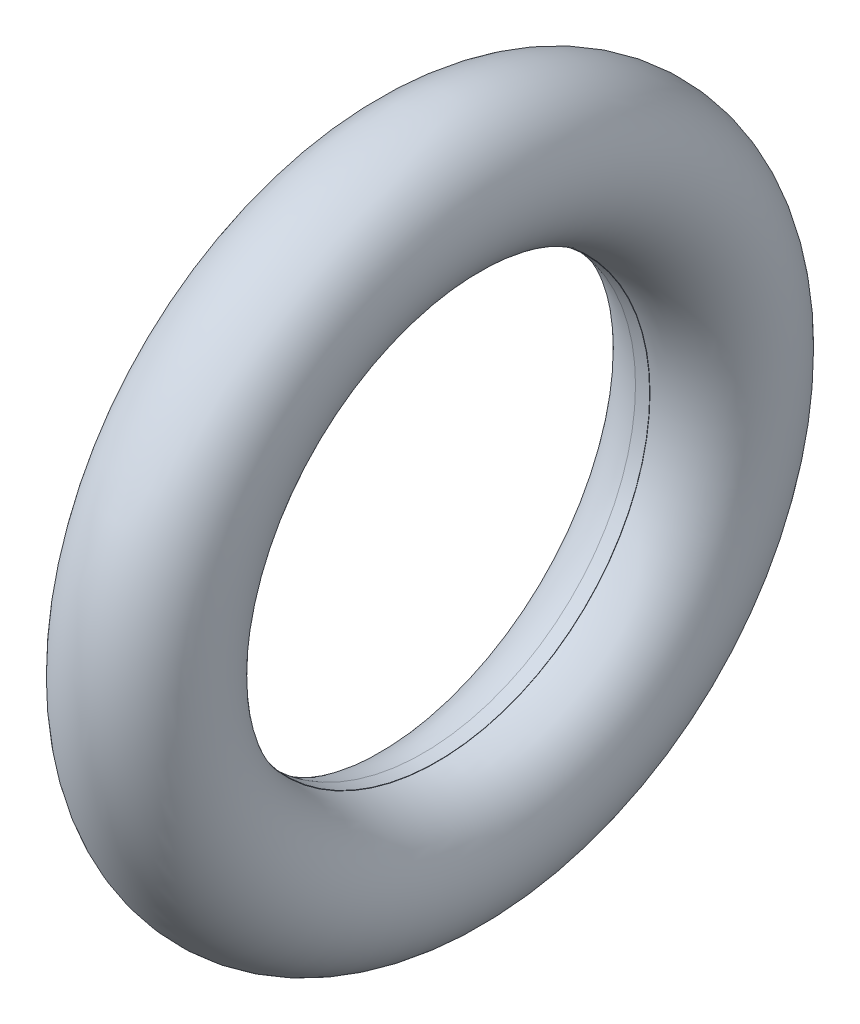
ISO-10303-21;
HEADER;
FILE_DESCRIPTION(('STEP AP214'),'2;1');
FILE_NAME('part.step','',(''),(''),'','','');
FILE_SCHEMA(('AUTOMOTIVE_DESIGN { 1 0 10303 214 1 1 1 1 }'));
ENDSEC;
DATA;
#1=APPLICATION_CONTEXT('core data for automotive mechanical design processes');
#2=APPLICATION_PROTOCOL_DEFINITION('international standard','automotive_design',2000,#1);
#3=PRODUCT_CONTEXT('',#1,'mechanical');
#4=PRODUCT('Part','Part','',(#3));
#5=PRODUCT_RELATED_PRODUCT_CATEGORY('part','',(#4));
#6=PRODUCT_DEFINITION_FORMATION('','',#4);
#7=PRODUCT_DEFINITION_CONTEXT('part definition',#1,'design');
#8=PRODUCT_DEFINITION('design','',#6,#7);
#9=PRODUCT_DEFINITION_SHAPE('','',#8);
#10=(LENGTH_UNIT() NAMED_UNIT(*) SI_UNIT(.MILLI.,.METRE.));
#11=(NAMED_UNIT(*) PLANE_ANGLE_UNIT() SI_UNIT($,.RADIAN.));
#12=(NAMED_UNIT(*) SI_UNIT($,.STERADIAN.) SOLID_ANGLE_UNIT());
#13=UNCERTAINTY_MEASURE_WITH_UNIT(LENGTH_MEASURE(1.E-05),#10,'distance_accuracy_value','');
#14=(GEOMETRIC_REPRESENTATION_CONTEXT(3) GLOBAL_UNCERTAINTY_ASSIGNED_CONTEXT((#13)) GLOBAL_UNIT_ASSIGNED_CONTEXT((#10,
#11,#12)) REPRESENTATION_CONTEXT('',''));
#15=CARTESIAN_POINT('',(0.,0.,0.));
#16=DIRECTION('',(0.,0.,1.));
#17=DIRECTION('',(1.,0.,0.));
#18=AXIS2_PLACEMENT_3D('',#15,#16,#17);
#19=CARTESIAN_POINT('',(0.,0.,0.));
#20=DIRECTION('',(-1.,0.,0.));
#21=DIRECTION('',(0.,0.,-1.));
#22=AXIS2_PLACEMENT_3D('',#19,#20,#21);
#23=CYLINDRICAL_SURFACE('',#22,3.);
#24=CARTESIAN_POINT('',(1.1,0.,0.));
#25=DIRECTION('',(1.,0.,0.));
#26=DIRECTION('',(0.,0.,-1.));
#27=AXIS2_PLACEMENT_3D('',#24,#25,#26);
#28=CIRCLE('',#27,3.);
#29=CARTESIAN_POINT('',(1.1,0.,-3.));
#30=VERTEX_POINT('',#29);
#31=EDGE_CURVE('E48',#30,#30,#28,.T.);
#32=ORIENTED_EDGE('',*,*,#31,.T.);
#33=EDGE_LOOP('',(#32));
#34=FACE_BOUND('',#33,.T.);
#35=CARTESIAN_POINT('',(0.9,0.,0.));
#36=DIRECTION('',(1.,0.,0.));
#37=DIRECTION('',(0.,0.,-1.));
#38=AXIS2_PLACEMENT_3D('',#35,#36,#37);
#39=CIRCLE('',#38,3.);
#40=CARTESIAN_POINT('',(0.9,0.,-3.));
#41=VERTEX_POINT('',#40);
#42=EDGE_CURVE('E10',#41,#41,#39,.T.);
#43=ORIENTED_EDGE('',*,*,#42,.F.);
#44=EDGE_LOOP('',(#43));
#45=FACE_BOUND('',#44,.T.);
#46=ADVANCED_FACE('F34',(#34,#45),#23,.F.);
#47=CARTESIAN_POINT('',(0.9,3.,0.));
#48=DIRECTION('',(1.,0.,0.));
#49=DIRECTION('',(0.,0.,1.));
#50=AXIS2_PLACEMENT_3D('',#47,#48,#49);
#51=PLANE('',#50);
#52=ORIENTED_EDGE('',*,*,#42,.T.);
#53=EDGE_LOOP('',(#52));
#54=FACE_BOUND('',#53,.T.);
#55=CARTESIAN_POINT('',(0.9,0.,0.));
#56=DIRECTION('',(1.,0.,0.));
#57=DIRECTION('',(0.,0.,-1.));
#58=AXIS2_PLACEMENT_3D('',#55,#56,#57);
#59=CIRCLE('',#58,3.00501256289338);
#60=CARTESIAN_POINT('',(0.9,0.,-3.00501256289338));
#61=VERTEX_POINT('',#60);
#62=EDGE_CURVE('E40',#61,#61,#59,.T.);
#63=ORIENTED_EDGE('',*,*,#62,.F.);
#64=EDGE_LOOP('',(#63));
#65=FACE_BOUND('',#64,.T.);
#66=ADVANCED_FACE('F64',(#54,#65),#51,.F.);
#67=CARTESIAN_POINT('',(1.,0.,0.));
#68=DIRECTION('',(-1.,0.,0.));
#69=DIRECTION('',(0.,0.,-1.));
#70=AXIS2_PLACEMENT_3D('',#67,#68,#69);
#71=TOROIDAL_SURFACE('',#70,4.,1.);
#72=ORIENTED_EDGE('',*,*,#62,.T.);
#73=EDGE_LOOP('',(#72));
#74=FACE_BOUND('',#73,.T.);
#75=CARTESIAN_POINT('',(1.1,0.,0.));
#76=DIRECTION('',(1.,0.,0.));
#77=DIRECTION('',(0.,0.,-1.));
#78=AXIS2_PLACEMENT_3D('',#75,#76,#77);
#79=CIRCLE('',#78,3.00501256289338);
#80=CARTESIAN_POINT('',(1.1,0.,-3.00501256289338));
#81=VERTEX_POINT('',#80);
#82=EDGE_CURVE('E44',#81,#81,#79,.T.);
#83=ORIENTED_EDGE('',*,*,#82,.F.);
#84=EDGE_LOOP('',(#83));
#85=FACE_BOUND('',#84,.T.);
#86=ADVANCED_FACE('F58',(#74,#85),#71,.T.);
#87=CARTESIAN_POINT('',(1.1,3.,0.));
#88=DIRECTION('',(-1.,0.,0.));
#89=DIRECTION('',(0.,0.,-1.));
#90=AXIS2_PLACEMENT_3D('',#87,#88,#89);
#91=PLANE('',#90);
#92=ORIENTED_EDGE('',*,*,#82,.T.);
#93=EDGE_LOOP('',(#92));
#94=FACE_BOUND('',#93,.T.);
#95=ORIENTED_EDGE('',*,*,#31,.F.);
#96=EDGE_LOOP('',(#95));
#97=FACE_BOUND('',#96,.T.);
#98=ADVANCED_FACE('F56',(#94,#97),#91,.F.);
#99=CLOSED_SHELL('',(#46,#66,#86,#98));
#100=MANIFOLD_SOLID_BREP('B2',#99);
#101=ADVANCED_BREP_SHAPE_REPRESENTATION('',(#18,#100),#14);
#102=SHAPE_DEFINITION_REPRESENTATION(#9,#101);
ENDSEC;
END-ISO-10303-21;
